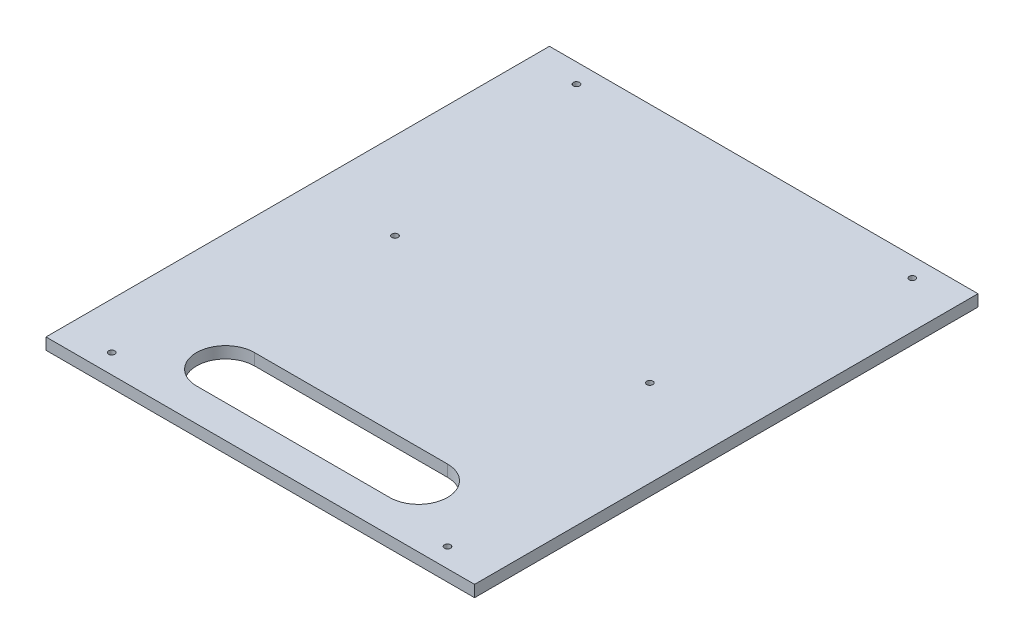
ISO-10303-21;
HEADER;
FILE_DESCRIPTION(('STEP AP214'),'2;1');
FILE_NAME('part.step','',(''),(''),'','','');
FILE_SCHEMA(('AUTOMOTIVE_DESIGN { 1 0 10303 214 1 1 1 1 }'));
ENDSEC;
DATA;
#1=APPLICATION_CONTEXT('core data for automotive mechanical design processes');
#2=APPLICATION_PROTOCOL_DEFINITION('international standard','automotive_design',2000,#1);
#3=PRODUCT_CONTEXT('',#1,'mechanical');
#4=PRODUCT('Part','Part','',(#3));
#5=PRODUCT_RELATED_PRODUCT_CATEGORY('part','',(#4));
#6=PRODUCT_DEFINITION_FORMATION('','',#4);
#7=PRODUCT_DEFINITION_CONTEXT('part definition',#1,'design');
#8=PRODUCT_DEFINITION('design','',#6,#7);
#9=PRODUCT_DEFINITION_SHAPE('','',#8);
#10=(LENGTH_UNIT() NAMED_UNIT(*) SI_UNIT(.MILLI.,.METRE.));
#11=(NAMED_UNIT(*) PLANE_ANGLE_UNIT() SI_UNIT($,.RADIAN.));
#12=(NAMED_UNIT(*) SI_UNIT($,.STERADIAN.) SOLID_ANGLE_UNIT());
#13=UNCERTAINTY_MEASURE_WITH_UNIT(LENGTH_MEASURE(1.E-05),#10,'distance_accuracy_value','');
#14=(GEOMETRIC_REPRESENTATION_CONTEXT(3) GLOBAL_UNCERTAINTY_ASSIGNED_CONTEXT((#13)) GLOBAL_UNIT_ASSIGNED_CONTEXT((#10,
#11,#12)) REPRESENTATION_CONTEXT('',''));
#15=CARTESIAN_POINT('',(0.,0.,0.));
#16=DIRECTION('',(0.,0.,1.));
#17=DIRECTION('',(1.,0.,0.));
#18=AXIS2_PLACEMENT_3D('',#15,#16,#17);
#19=CARTESIAN_POINT('',(-111.,6.,125.612652878949));
#20=DIRECTION('',(1.,0.,0.));
#21=DIRECTION('',(0.,0.,-1.));
#22=AXIS2_PLACEMENT_3D('',#19,#20,#21);
#23=PLANE('',#22);
#24=DIRECTION('',(0.,0.,1.));
#25=VECTOR('',#24,1.);
#26=CARTESIAN_POINT('',(-111.,6.,-125.612652878949));
#27=LINE('',#26,#25);
#28=CARTESIAN_POINT('',(-111.,6.,-95.1873471210512));
#29=VERTEX_POINT('',#28);
#30=CARTESIAN_POINT('',(-111.,6.,165.612652878949));
#31=VERTEX_POINT('',#30);
#32=EDGE_CURVE('E170',#29,#31,#27,.T.);
#33=ORIENTED_EDGE('',*,*,#32,.F.);
#34=DIRECTION('',(0.,-1.,0.));
#35=VECTOR('',#34,1.);
#36=CARTESIAN_POINT('',(-111.,10.,-95.1873471210512));
#37=LINE('',#36,#35);
#38=CARTESIAN_POINT('',(-111.,0.,-95.1873471210512));
#39=VERTEX_POINT('',#38);
#40=EDGE_CURVE('E153',#29,#39,#37,.T.);
#41=ORIENTED_EDGE('',*,*,#40,.T.);
#42=DIRECTION('',(0.,0.,1.));
#43=VECTOR('',#42,1.);
#44=CARTESIAN_POINT('',(-111.,0.,125.612652878949));
#45=LINE('',#44,#43);
#46=CARTESIAN_POINT('',(-111.,0.,165.612652878949));
#47=VERTEX_POINT('',#46);
#48=EDGE_CURVE('E169',#39,#47,#45,.T.);
#49=ORIENTED_EDGE('',*,*,#48,.T.);
#50=DIRECTION('',(0.,-1.,0.));
#51=VECTOR('',#50,1.);
#52=CARTESIAN_POINT('',(-111.,6.,165.612652878949));
#53=LINE('',#52,#51);
#54=EDGE_CURVE('E187',#31,#47,#53,.T.);
#55=ORIENTED_EDGE('',*,*,#54,.F.);
#56=EDGE_LOOP('',(#33,#41,#49,#55));
#57=FACE_BOUND('',#56,.T.);
#58=ADVANCED_FACE('F32',(#57),#23,.F.);
#59=CARTESIAN_POINT('',(-111.,6.,165.612652878949));
#60=DIRECTION('',(0.,0.,-1.));
#61=DIRECTION('',(-1.,0.,0.));
#62=AXIS2_PLACEMENT_3D('',#59,#60,#61);
#63=PLANE('',#62);
#64=DIRECTION('',(1.,0.,0.));
#65=VECTOR('',#64,1.);
#66=CARTESIAN_POINT('',(-111.,0.,165.612652878949));
#67=LINE('',#66,#65);
#68=CARTESIAN_POINT('',(111.,0.,165.612652878949));
#69=VERTEX_POINT('',#68);
#70=EDGE_CURVE('E180',#47,#69,#67,.T.);
#71=ORIENTED_EDGE('',*,*,#70,.T.);
#72=DIRECTION('',(0.,-1.,0.));
#73=VECTOR('',#72,1.);
#74=CARTESIAN_POINT('',(111.,6.,165.612652878949));
#75=LINE('',#74,#73);
#76=CARTESIAN_POINT('',(111.,6.,165.612652878949));
#77=VERTEX_POINT('',#76);
#78=EDGE_CURVE('E178',#77,#69,#75,.T.);
#79=ORIENTED_EDGE('',*,*,#78,.F.);
#80=DIRECTION('',(1.,0.,0.));
#81=VECTOR('',#80,1.);
#82=CARTESIAN_POINT('',(-111.,6.,165.612652878949));
#83=LINE('',#82,#81);
#84=EDGE_CURVE('E172',#31,#77,#83,.T.);
#85=ORIENTED_EDGE('',*,*,#84,.F.);
#86=ORIENTED_EDGE('',*,*,#54,.T.);
#87=EDGE_LOOP('',(#71,#79,#85,#86));
#88=FACE_BOUND('',#87,.T.);
#89=ADVANCED_FACE('F214',(#88),#63,.F.);
#90=CARTESIAN_POINT('',(111.,6.,-125.612652878949));
#91=DIRECTION('',(-1.,0.,0.));
#92=DIRECTION('',(0.,0.,1.));
#93=AXIS2_PLACEMENT_3D('',#90,#91,#92);
#94=PLANE('',#93);
#95=DIRECTION('',(0.,0.,-1.));
#96=VECTOR('',#95,1.);
#97=CARTESIAN_POINT('',(111.,0.,-125.612652878949));
#98=LINE('',#97,#96);
#99=CARTESIAN_POINT('',(111.,0.,-95.1873471210512));
#100=VERTEX_POINT('',#99);
#101=EDGE_CURVE('E173',#69,#100,#98,.T.);
#102=ORIENTED_EDGE('',*,*,#101,.T.);
#103=DIRECTION('',(0.,-1.,0.));
#104=VECTOR('',#103,1.);
#105=CARTESIAN_POINT('',(111.,10.,-95.1873471210512));
#106=LINE('',#105,#104);
#107=CARTESIAN_POINT('',(111.,6.,-95.1873471210512));
#108=VERTEX_POINT('',#107);
#109=EDGE_CURVE('E151',#108,#100,#106,.T.);
#110=ORIENTED_EDGE('',*,*,#109,.F.);
#111=DIRECTION('',(0.,0.,-1.));
#112=VECTOR('',#111,1.);
#113=CARTESIAN_POINT('',(111.,6.,125.612652878949));
#114=LINE('',#113,#112);
#115=EDGE_CURVE('E175',#77,#108,#114,.T.);
#116=ORIENTED_EDGE('',*,*,#115,.F.);
#117=ORIENTED_EDGE('',*,*,#78,.T.);
#118=EDGE_LOOP('',(#102,#110,#116,#117));
#119=FACE_BOUND('',#118,.T.);
#120=ADVANCED_FACE('F219',(#119),#94,.F.);
#121=CARTESIAN_POINT('',(0.,6.,0.));
#122=DIRECTION('',(0.,1.,0.));
#123=DIRECTION('',(0.,0.,1.));
#124=AXIS2_PLACEMENT_3D('',#121,#122,#123);
#125=PLANE('',#124);
#126=CARTESIAN_POINT('',(-50.,6.,133.612652878949));
#127=DIRECTION('',(0.,1.,0.));
#128=DIRECTION('',(0.,0.,1.));
#129=AXIS2_PLACEMENT_3D('',#126,#127,#128);
#130=CIRCLE('',#129,15.);
#131=CARTESIAN_POINT('',(-50.,6.,118.612652878949));
#132=VERTEX_POINT('',#131);
#133=CARTESIAN_POINT('',(-50.,6.,148.612652878949));
#134=VERTEX_POINT('',#133);
#135=EDGE_CURVE('E46',#132,#134,#130,.T.);
#136=ORIENTED_EDGE('',*,*,#135,.F.);
#137=DIRECTION('',(-1.,0.,0.));
#138=VECTOR('',#137,1.);
#139=CARTESIAN_POINT('',(-50.,6.,118.612652878949));
#140=LINE('',#139,#138);
#141=CARTESIAN_POINT('',(50.,6.,118.612652878949));
#142=VERTEX_POINT('',#141);
#143=EDGE_CURVE('E115',#142,#132,#140,.T.);
#144=ORIENTED_EDGE('',*,*,#143,.F.);
#145=CARTESIAN_POINT('',(50.,6.,133.612652878949));
#146=DIRECTION('',(0.,1.,0.));
#147=DIRECTION('',(0.,0.,1.));
#148=AXIS2_PLACEMENT_3D('',#145,#146,#147);
#149=CIRCLE('',#148,15.);
#150=CARTESIAN_POINT('',(50.,6.,148.612652878949));
#151=VERTEX_POINT('',#150);
#152=EDGE_CURVE('E99',#151,#142,#149,.T.);
#153=ORIENTED_EDGE('',*,*,#152,.F.);
#154=DIRECTION('',(1.,0.,0.));
#155=VECTOR('',#154,1.);
#156=CARTESIAN_POINT('',(50.,6.,148.612652878949));
#157=LINE('',#156,#155);
#158=EDGE_CURVE('E108',#134,#151,#157,.T.);
#159=ORIENTED_EDGE('',*,*,#158,.F.);
#160=EDGE_LOOP('',(#136,#144,#153,#159));
#161=FACE_BOUND('',#160,.T.);
#162=CARTESIAN_POINT('',(-87.0000000000001,6.,155.612652878949));
#163=DIRECTION('',(0.,1.,0.));
#164=DIRECTION('',(0.,0.,1.));
#165=AXIS2_PLACEMENT_3D('',#162,#163,#164);
#166=CIRCLE('',#165,1.60000000000001);
#167=CARTESIAN_POINT('',(-87.0000000000001,6.,157.212652878949));
#168=VERTEX_POINT('',#167);
#169=EDGE_CURVE('E145',#168,#168,#166,.T.);
#170=ORIENTED_EDGE('',*,*,#169,.F.);
#171=EDGE_LOOP('',(#170));
#172=FACE_BOUND('',#171,.T.);
#173=CARTESIAN_POINT('',(87.,6.,-85.1873471210512));
#174=DIRECTION('',(0.,1.,0.));
#175=DIRECTION('',(0.,0.,1.));
#176=AXIS2_PLACEMENT_3D('',#173,#174,#175);
#177=CIRCLE('',#176,1.59999999999999);
#178=CARTESIAN_POINT('',(87.,6.,-83.5873471210512));
#179=VERTEX_POINT('',#178);
#180=EDGE_CURVE('E142',#179,#179,#177,.T.);
#181=ORIENTED_EDGE('',*,*,#180,.F.);
#182=EDGE_LOOP('',(#181));
#183=FACE_BOUND('',#182,.T.);
#184=CARTESIAN_POINT('',(-87.,6.,-85.1873471210512));
#185=DIRECTION('',(0.,1.,0.));
#186=DIRECTION('',(0.,0.,1.));
#187=AXIS2_PLACEMENT_3D('',#184,#185,#186);
#188=CIRCLE('',#187,1.60000000000001);
#189=CARTESIAN_POINT('',(-87.,6.,-83.5873471210512));
#190=VERTEX_POINT('',#189);
#191=EDGE_CURVE('E139',#190,#190,#188,.T.);
#192=ORIENTED_EDGE('',*,*,#191,.F.);
#193=EDGE_LOOP('',(#192));
#194=FACE_BOUND('',#193,.T.);
#195=CARTESIAN_POINT('',(87.,6.,155.612652878949));
#196=DIRECTION('',(0.,1.,0.));
#197=DIRECTION('',(0.,0.,1.));
#198=AXIS2_PLACEMENT_3D('',#195,#196,#197);
#199=CIRCLE('',#198,1.6);
#200=CARTESIAN_POINT('',(87.,6.,157.212652878949));
#201=VERTEX_POINT('',#200);
#202=EDGE_CURVE('E136',#201,#201,#199,.T.);
#203=ORIENTED_EDGE('',*,*,#202,.F.);
#204=EDGE_LOOP('',(#203));
#205=FACE_BOUND('',#204,.T.);
#206=DIRECTION('',(1.,0.,0.));
#207=VECTOR('',#206,1.);
#208=CARTESIAN_POINT('',(0.,6.,-95.1873471210512));
#209=LINE('',#208,#207);
#210=EDGE_CURVE('E167',#29,#108,#209,.T.);
#211=ORIENTED_EDGE('',*,*,#210,.F.);
#212=ORIENTED_EDGE('',*,*,#32,.T.);
#213=ORIENTED_EDGE('',*,*,#84,.T.);
#214=ORIENTED_EDGE('',*,*,#115,.T.);
#215=EDGE_LOOP('',(#211,#212,#213,#214));
#216=FACE_BOUND('',#215,.T.);
#217=CARTESIAN_POINT('',(-66.,6.,29.8126528789488));
#218=DIRECTION('',(0.,1.,0.));
#219=DIRECTION('',(0.,0.,1.));
#220=AXIS2_PLACEMENT_3D('',#217,#218,#219);
#221=CIRCLE('',#220,1.6);
#222=CARTESIAN_POINT('',(-66.,6.,31.4126528789488));
#223=VERTEX_POINT('',#222);
#224=EDGE_CURVE('E164',#223,#223,#221,.T.);
#225=ORIENTED_EDGE('',*,*,#224,.F.);
#226=EDGE_LOOP('',(#225));
#227=FACE_BOUND('',#226,.T.);
#228=CARTESIAN_POINT('',(66.,6.,29.8126528789488));
#229=DIRECTION('',(0.,1.,0.));
#230=DIRECTION('',(0.,0.,1.));
#231=AXIS2_PLACEMENT_3D('',#228,#229,#230);
#232=CIRCLE('',#231,1.6);
#233=CARTESIAN_POINT('',(66.,6.,31.4126528789488));
#234=VERTEX_POINT('',#233);
#235=EDGE_CURVE('E156',#234,#234,#232,.T.);
#236=ORIENTED_EDGE('',*,*,#235,.F.);
#237=EDGE_LOOP('',(#236));
#238=FACE_BOUND('',#237,.T.);
#239=ADVANCED_FACE('F112',(#161,#172,#183,#194,#205,#216,#227,#238),#125,.T.);
#240=CARTESIAN_POINT('',(0.,0.,0.));
#241=DIRECTION('',(0.,1.,0.));
#242=DIRECTION('',(0.,0.,1.));
#243=AXIS2_PLACEMENT_3D('',#240,#241,#242);
#244=PLANE('',#243);
#245=DIRECTION('',(-1.,0.,0.));
#246=VECTOR('',#245,1.);
#247=CARTESIAN_POINT('',(0.,0.,118.612652878949));
#248=LINE('',#247,#246);
#249=CARTESIAN_POINT('',(50.,0.,118.612652878949));
#250=VERTEX_POINT('',#249);
#251=CARTESIAN_POINT('',(-50.,0.,118.612652878949));
#252=VERTEX_POINT('',#251);
#253=EDGE_CURVE('E39',#250,#252,#248,.T.);
#254=ORIENTED_EDGE('',*,*,#253,.T.);
#255=CARTESIAN_POINT('',(-50.,0.,133.612652878949));
#256=DIRECTION('',(0.,1.,0.));
#257=DIRECTION('',(0.,0.,1.));
#258=AXIS2_PLACEMENT_3D('',#255,#256,#257);
#259=CIRCLE('',#258,15.);
#260=CARTESIAN_POINT('',(-50.,0.,148.612652878949));
#261=VERTEX_POINT('',#260);
#262=EDGE_CURVE('E11',#252,#261,#259,.T.);
#263=ORIENTED_EDGE('',*,*,#262,.T.);
#264=DIRECTION('',(1.,0.,0.));
#265=VECTOR('',#264,1.);
#266=CARTESIAN_POINT('',(0.,0.,148.612652878949));
#267=LINE('',#266,#265);
#268=CARTESIAN_POINT('',(50.,0.,148.612652878949));
#269=VERTEX_POINT('',#268);
#270=EDGE_CURVE('E190',#261,#269,#267,.T.);
#271=ORIENTED_EDGE('',*,*,#270,.T.);
#272=CARTESIAN_POINT('',(50.,0.,133.612652878949));
#273=DIRECTION('',(0.,1.,0.));
#274=DIRECTION('',(0.,0.,1.));
#275=AXIS2_PLACEMENT_3D('',#272,#273,#274);
#276=CIRCLE('',#275,15.);
#277=EDGE_CURVE('E102',#269,#250,#276,.T.);
#278=ORIENTED_EDGE('',*,*,#277,.T.);
#279=EDGE_LOOP('',(#254,#263,#271,#278));
#280=FACE_BOUND('',#279,.T.);
#281=CARTESIAN_POINT('',(-87.0000000000001,0.,155.612652878949));
#282=DIRECTION('',(0.,-1.,0.));
#283=DIRECTION('',(0.,0.,-1.));
#284=AXIS2_PLACEMENT_3D('',#281,#282,#283);
#285=CIRCLE('',#284,1.60000000000001);
#286=CARTESIAN_POINT('',(-87.0000000000001,0.,154.012652878949));
#287=VERTEX_POINT('',#286);
#288=EDGE_CURVE('E128',#287,#287,#285,.T.);
#289=ORIENTED_EDGE('',*,*,#288,.F.);
#290=EDGE_LOOP('',(#289));
#291=FACE_BOUND('',#290,.T.);
#292=CARTESIAN_POINT('',(87.,0.,-85.1873471210512));
#293=DIRECTION('',(0.,-1.,0.));
#294=DIRECTION('',(0.,0.,-1.));
#295=AXIS2_PLACEMENT_3D('',#292,#293,#294);
#296=CIRCLE('',#295,1.59999999999999);
#297=CARTESIAN_POINT('',(87.,0.,-86.7873471210512));
#298=VERTEX_POINT('',#297);
#299=EDGE_CURVE('E127',#298,#298,#296,.T.);
#300=ORIENTED_EDGE('',*,*,#299,.F.);
#301=EDGE_LOOP('',(#300));
#302=FACE_BOUND('',#301,.T.);
#303=CARTESIAN_POINT('',(-87.,0.,-85.1873471210512));
#304=DIRECTION('',(0.,-1.,0.));
#305=DIRECTION('',(0.,0.,-1.));
#306=AXIS2_PLACEMENT_3D('',#303,#304,#305);
#307=CIRCLE('',#306,1.60000000000001);
#308=CARTESIAN_POINT('',(-87.,0.,-86.7873471210512));
#309=VERTEX_POINT('',#308);
#310=EDGE_CURVE('E122',#309,#309,#307,.T.);
#311=ORIENTED_EDGE('',*,*,#310,.F.);
#312=EDGE_LOOP('',(#311));
#313=FACE_BOUND('',#312,.T.);
#314=CARTESIAN_POINT('',(87.,0.,155.612652878949));
#315=DIRECTION('',(0.,-1.,0.));
#316=DIRECTION('',(0.,0.,-1.));
#317=AXIS2_PLACEMENT_3D('',#314,#315,#316);
#318=CIRCLE('',#317,1.6);
#319=CARTESIAN_POINT('',(87.,0.,154.012652878949));
#320=VERTEX_POINT('',#319);
#321=EDGE_CURVE('E131',#320,#320,#318,.T.);
#322=ORIENTED_EDGE('',*,*,#321,.F.);
#323=EDGE_LOOP('',(#322));
#324=FACE_BOUND('',#323,.T.);
#325=CARTESIAN_POINT('',(-66.,0.,29.8126528789488));
#326=DIRECTION('',(0.,-1.,0.));
#327=DIRECTION('',(0.,0.,-1.));
#328=AXIS2_PLACEMENT_3D('',#325,#326,#327);
#329=CIRCLE('',#328,1.6);
#330=CARTESIAN_POINT('',(-66.,0.,28.2126528789488));
#331=VERTEX_POINT('',#330);
#332=EDGE_CURVE('E152',#331,#331,#329,.T.);
#333=ORIENTED_EDGE('',*,*,#332,.F.);
#334=EDGE_LOOP('',(#333));
#335=FACE_BOUND('',#334,.T.);
#336=CARTESIAN_POINT('',(66.,0.,29.8126528789488));
#337=DIRECTION('',(0.,-1.,0.));
#338=DIRECTION('',(0.,0.,-1.));
#339=AXIS2_PLACEMENT_3D('',#336,#337,#338);
#340=CIRCLE('',#339,1.6);
#341=CARTESIAN_POINT('',(66.,0.,28.2126528789488));
#342=VERTEX_POINT('',#341);
#343=EDGE_CURVE('E148',#342,#342,#340,.T.);
#344=ORIENTED_EDGE('',*,*,#343,.F.);
#345=EDGE_LOOP('',(#344));
#346=FACE_BOUND('',#345,.T.);
#347=ORIENTED_EDGE('',*,*,#48,.F.);
#348=DIRECTION('',(-1.,0.,0.));
#349=VECTOR('',#348,1.);
#350=CARTESIAN_POINT('',(111.,0.,-95.1873471210512));
#351=LINE('',#350,#349);
#352=EDGE_CURVE('E149',#100,#39,#351,.T.);
#353=ORIENTED_EDGE('',*,*,#352,.F.);
#354=ORIENTED_EDGE('',*,*,#101,.F.);
#355=ORIENTED_EDGE('',*,*,#70,.F.);
#356=EDGE_LOOP('',(#347,#353,#354,#355));
#357=FACE_BOUND('',#356,.T.);
#358=ADVANCED_FACE('F194',(#280,#291,#302,#313,#324,#335,#346,#357),#244,.F.);
#359=CARTESIAN_POINT('',(66.,10.,29.8126528789488));
#360=DIRECTION('',(0.,-1.,0.));
#361=DIRECTION('',(0.,0.,-1.));
#362=AXIS2_PLACEMENT_3D('',#359,#360,#361);
#363=CYLINDRICAL_SURFACE('',#362,1.6);
#364=ORIENTED_EDGE('',*,*,#235,.T.);
#365=EDGE_LOOP('',(#364));
#366=FACE_BOUND('',#365,.T.);
#367=ORIENTED_EDGE('',*,*,#343,.T.);
#368=EDGE_LOOP('',(#367));
#369=FACE_BOUND('',#368,.T.);
#370=ADVANCED_FACE('F238',(#366,#369),#363,.F.);
#371=CARTESIAN_POINT('',(-66.,10.,29.8126528789488));
#372=DIRECTION('',(0.,-1.,0.));
#373=DIRECTION('',(0.,0.,-1.));
#374=AXIS2_PLACEMENT_3D('',#371,#372,#373);
#375=CYLINDRICAL_SURFACE('',#374,1.6);
#376=ORIENTED_EDGE('',*,*,#224,.T.);
#377=EDGE_LOOP('',(#376));
#378=FACE_BOUND('',#377,.T.);
#379=ORIENTED_EDGE('',*,*,#332,.T.);
#380=EDGE_LOOP('',(#379));
#381=FACE_BOUND('',#380,.T.);
#382=ADVANCED_FACE('F244',(#378,#381),#375,.F.);
#383=CARTESIAN_POINT('',(111.,10.,-95.1873471210512));
#384=DIRECTION('',(0.,0.,1.));
#385=DIRECTION('',(1.,0.,0.));
#386=AXIS2_PLACEMENT_3D('',#383,#384,#385);
#387=PLANE('',#386);
#388=ORIENTED_EDGE('',*,*,#210,.T.);
#389=ORIENTED_EDGE('',*,*,#109,.T.);
#390=ORIENTED_EDGE('',*,*,#352,.T.);
#391=ORIENTED_EDGE('',*,*,#40,.F.);
#392=EDGE_LOOP('',(#388,#389,#390,#391));
#393=FACE_BOUND('',#392,.T.);
#394=ADVANCED_FACE('F232',(#393),#387,.F.);
#395=CARTESIAN_POINT('',(87.,10.,155.612652878949));
#396=DIRECTION('',(0.,-1.,0.));
#397=DIRECTION('',(0.,0.,-1.));
#398=AXIS2_PLACEMENT_3D('',#395,#396,#397);
#399=CYLINDRICAL_SURFACE('',#398,1.6);
#400=ORIENTED_EDGE('',*,*,#202,.T.);
#401=EDGE_LOOP('',(#400));
#402=FACE_BOUND('',#401,.T.);
#403=ORIENTED_EDGE('',*,*,#321,.T.);
#404=EDGE_LOOP('',(#403));
#405=FACE_BOUND('',#404,.T.);
#406=ADVANCED_FACE('F313',(#402,#405),#399,.F.);
#407=CARTESIAN_POINT('',(-87.,10.,-85.1873471210512));
#408=DIRECTION('',(0.,-1.,0.));
#409=DIRECTION('',(0.,0.,-1.));
#410=AXIS2_PLACEMENT_3D('',#407,#408,#409);
#411=CYLINDRICAL_SURFACE('',#410,1.60000000000001);
#412=ORIENTED_EDGE('',*,*,#191,.T.);
#413=EDGE_LOOP('',(#412));
#414=FACE_BOUND('',#413,.T.);
#415=ORIENTED_EDGE('',*,*,#310,.T.);
#416=EDGE_LOOP('',(#415));
#417=FACE_BOUND('',#416,.T.);
#418=ADVANCED_FACE('F304',(#414,#417),#411,.F.);
#419=CARTESIAN_POINT('',(87.,10.,-85.1873471210512));
#420=DIRECTION('',(0.,-1.,0.));
#421=DIRECTION('',(0.,0.,-1.));
#422=AXIS2_PLACEMENT_3D('',#419,#420,#421);
#423=CYLINDRICAL_SURFACE('',#422,1.59999999999999);
#424=ORIENTED_EDGE('',*,*,#180,.T.);
#425=EDGE_LOOP('',(#424));
#426=FACE_BOUND('',#425,.T.);
#427=ORIENTED_EDGE('',*,*,#299,.T.);
#428=EDGE_LOOP('',(#427));
#429=FACE_BOUND('',#428,.T.);
#430=ADVANCED_FACE('F208',(#426,#429),#423,.F.);
#431=CARTESIAN_POINT('',(-87.0000000000001,10.,155.612652878949));
#432=DIRECTION('',(0.,-1.,0.));
#433=DIRECTION('',(0.,0.,-1.));
#434=AXIS2_PLACEMENT_3D('',#431,#432,#433);
#435=CYLINDRICAL_SURFACE('',#434,1.60000000000001);
#436=ORIENTED_EDGE('',*,*,#169,.T.);
#437=EDGE_LOOP('',(#436));
#438=FACE_BOUND('',#437,.T.);
#439=ORIENTED_EDGE('',*,*,#288,.T.);
#440=EDGE_LOOP('',(#439));
#441=FACE_BOUND('',#440,.T.);
#442=ADVANCED_FACE('F201',(#438,#441),#435,.F.);
#443=CARTESIAN_POINT('',(-50.,-4.,133.612652878949));
#444=DIRECTION('',(0.,1.,0.));
#445=DIRECTION('',(0.,0.,1.));
#446=AXIS2_PLACEMENT_3D('',#443,#444,#445);
#447=CYLINDRICAL_SURFACE('',#446,15.);
#448=DIRECTION('',(0.,1.,0.));
#449=VECTOR('',#448,1.);
#450=CARTESIAN_POINT('',(-50.,-4.,118.612652878949));
#451=LINE('',#450,#449);
#452=EDGE_CURVE('E120',#252,#132,#451,.T.);
#453=ORIENTED_EDGE('',*,*,#452,.T.);
#454=ORIENTED_EDGE('',*,*,#135,.T.);
#455=DIRECTION('',(0.,1.,0.));
#456=VECTOR('',#455,1.);
#457=CARTESIAN_POINT('',(-50.,-4.,148.612652878949));
#458=LINE('',#457,#456);
#459=EDGE_CURVE('E105',#261,#134,#458,.T.);
#460=ORIENTED_EDGE('',*,*,#459,.F.);
#461=ORIENTED_EDGE('',*,*,#262,.F.);
#462=EDGE_LOOP('',(#453,#454,#460,#461));
#463=FACE_BOUND('',#462,.T.);
#464=ADVANCED_FACE('F199',(#463),#447,.F.);
#465=CARTESIAN_POINT('',(-50.,-4.,118.612652878949));
#466=DIRECTION('',(0.,0.,-1.));
#467=DIRECTION('',(-1.,0.,0.));
#468=AXIS2_PLACEMENT_3D('',#465,#466,#467);
#469=PLANE('',#468);
#470=DIRECTION('',(0.,1.,0.));
#471=VECTOR('',#470,1.);
#472=CARTESIAN_POINT('',(50.,-4.,118.612652878949));
#473=LINE('',#472,#471);
#474=EDGE_CURVE('E104',#250,#142,#473,.T.);
#475=ORIENTED_EDGE('',*,*,#474,.T.);
#476=ORIENTED_EDGE('',*,*,#143,.T.);
#477=ORIENTED_EDGE('',*,*,#452,.F.);
#478=ORIENTED_EDGE('',*,*,#253,.F.);
#479=EDGE_LOOP('',(#475,#476,#477,#478));
#480=FACE_BOUND('',#479,.T.);
#481=ADVANCED_FACE('F198',(#480),#469,.F.);
#482=CARTESIAN_POINT('',(50.,-4.,133.612652878949));
#483=DIRECTION('',(0.,1.,0.));
#484=DIRECTION('',(0.,0.,1.));
#485=AXIS2_PLACEMENT_3D('',#482,#483,#484);
#486=CYLINDRICAL_SURFACE('',#485,15.);
#487=DIRECTION('',(0.,1.,0.));
#488=VECTOR('',#487,1.);
#489=CARTESIAN_POINT('',(50.,-4.,148.612652878949));
#490=LINE('',#489,#488);
#491=EDGE_CURVE('E54',#269,#151,#490,.T.);
#492=ORIENTED_EDGE('',*,*,#491,.T.);
#493=ORIENTED_EDGE('',*,*,#152,.T.);
#494=ORIENTED_EDGE('',*,*,#474,.F.);
#495=ORIENTED_EDGE('',*,*,#277,.F.);
#496=EDGE_LOOP('',(#492,#493,#494,#495));
#497=FACE_BOUND('',#496,.T.);
#498=ADVANCED_FACE('F96',(#497),#486,.F.);
#499=CARTESIAN_POINT('',(50.,-4.,148.612652878949));
#500=DIRECTION('',(0.,0.,1.));
#501=DIRECTION('',(1.,0.,0.));
#502=AXIS2_PLACEMENT_3D('',#499,#500,#501);
#503=PLANE('',#502);
#504=ORIENTED_EDGE('',*,*,#459,.T.);
#505=ORIENTED_EDGE('',*,*,#158,.T.);
#506=ORIENTED_EDGE('',*,*,#491,.F.);
#507=ORIENTED_EDGE('',*,*,#270,.F.);
#508=EDGE_LOOP('',(#504,#505,#506,#507));
#509=FACE_BOUND('',#508,.T.);
#510=ADVANCED_FACE('F109',(#509),#503,.F.);
#511=CLOSED_SHELL('',(#58,#89,#120,#239,#358,#370,#382,#394,#406,#418,#430,#442,#464,#481,#498,#510));
#512=MANIFOLD_SOLID_BREP('B2',#511);
#513=ADVANCED_BREP_SHAPE_REPRESENTATION('',(#18,#512),#14);
#514=SHAPE_DEFINITION_REPRESENTATION(#9,#513);
ENDSEC;
END-ISO-10303-21;
